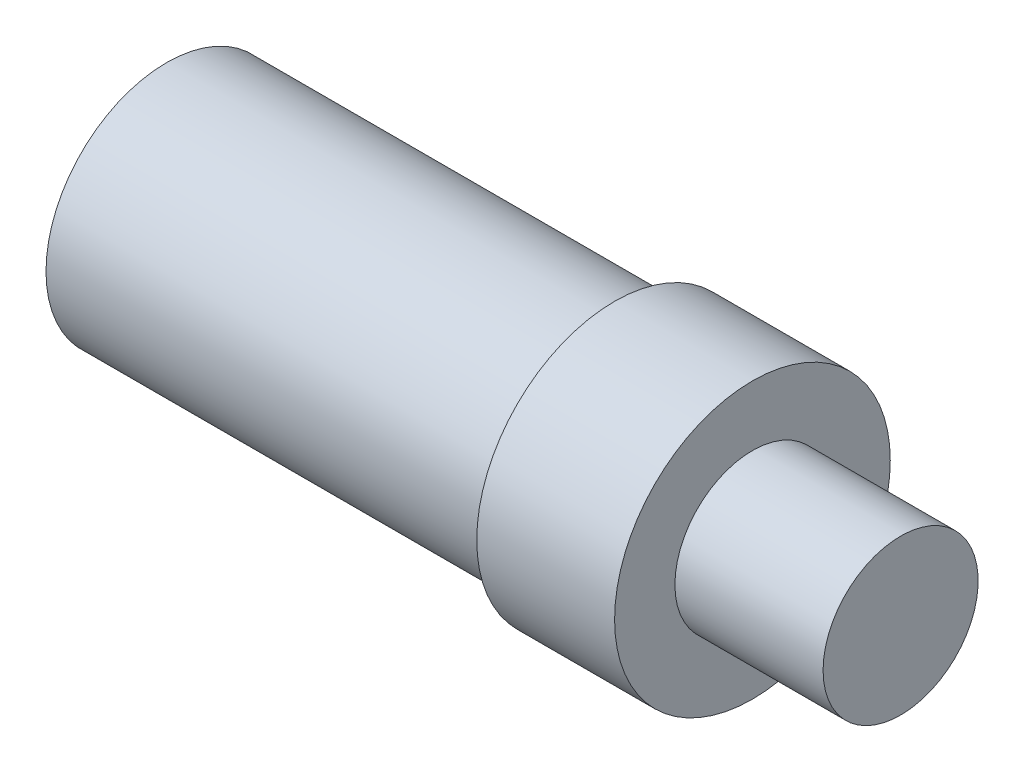
ISO-10303-21;
HEADER;
FILE_DESCRIPTION(('STEP AP214'),'2;1');
FILE_NAME('part.step','',(''),(''),'','','');
FILE_SCHEMA(('AUTOMOTIVE_DESIGN { 1 0 10303 214 1 1 1 1 }'));
ENDSEC;
DATA;
#1=APPLICATION_CONTEXT('core data for automotive mechanical design processes');
#2=APPLICATION_PROTOCOL_DEFINITION('international standard','automotive_design',2000,#1);
#3=PRODUCT_CONTEXT('',#1,'mechanical');
#4=PRODUCT('Part','Part','',(#3));
#5=PRODUCT_RELATED_PRODUCT_CATEGORY('part','',(#4));
#6=PRODUCT_DEFINITION_FORMATION('','',#4);
#7=PRODUCT_DEFINITION_CONTEXT('part definition',#1,'design');
#8=PRODUCT_DEFINITION('design','',#6,#7);
#9=PRODUCT_DEFINITION_SHAPE('','',#8);
#10=(LENGTH_UNIT() NAMED_UNIT(*) SI_UNIT(.MILLI.,.METRE.));
#11=(NAMED_UNIT(*) PLANE_ANGLE_UNIT() SI_UNIT($,.RADIAN.));
#12=(NAMED_UNIT(*) SI_UNIT($,.STERADIAN.) SOLID_ANGLE_UNIT());
#13=UNCERTAINTY_MEASURE_WITH_UNIT(LENGTH_MEASURE(1.E-05),#10,'distance_accuracy_value','');
#14=(GEOMETRIC_REPRESENTATION_CONTEXT(3) GLOBAL_UNCERTAINTY_ASSIGNED_CONTEXT((#13)) GLOBAL_UNIT_ASSIGNED_CONTEXT((#10,
#11,#12)) REPRESENTATION_CONTEXT('',''));
#15=CARTESIAN_POINT('',(0.,0.,0.));
#16=DIRECTION('',(0.,0.,1.));
#17=DIRECTION('',(1.,0.,0.));
#18=AXIS2_PLACEMENT_3D('',#15,#16,#17);
#19=CARTESIAN_POINT('',(-33.4,0.,0.));
#20=DIRECTION('',(-1.,0.,0.));
#21=DIRECTION('',(0.,0.,1.));
#22=AXIS2_PLACEMENT_3D('',#19,#20,#21);
#23=PLANE('',#22);
#24=CARTESIAN_POINT('',(-33.4,0.,0.));
#25=DIRECTION('',(-1.,0.,0.));
#26=DIRECTION('',(0.,0.,1.));
#27=AXIS2_PLACEMENT_3D('',#24,#25,#26);
#28=CIRCLE('',#27,4.5);
#29=CARTESIAN_POINT('',(-33.4,0.,4.5));
#30=VERTEX_POINT('',#29);
#31=EDGE_CURVE('E10',#30,#30,#28,.T.);
#32=ORIENTED_EDGE('',*,*,#31,.F.);
#33=EDGE_LOOP('',(#32));
#34=FACE_BOUND('',#33,.T.);
#35=ADVANCED_FACE('F39',(#34),#23,.F.);
#36=CARTESIAN_POINT('',(-300.,0.,0.));
#37=DIRECTION('',(-1.,0.,0.));
#38=DIRECTION('',(0.,0.,1.));
#39=AXIS2_PLACEMENT_3D('',#36,#37,#38);
#40=CYLINDRICAL_SURFACE('',#39,4.5);
#41=CARTESIAN_POINT('',(-42.,0.,0.));
#42=DIRECTION('',(-1.,0.,0.));
#43=DIRECTION('',(0.,0.,1.));
#44=AXIS2_PLACEMENT_3D('',#41,#42,#43);
#45=CIRCLE('',#44,4.5);
#46=CARTESIAN_POINT('',(-42.,0.,4.5));
#47=VERTEX_POINT('',#46);
#48=EDGE_CURVE('E44',#47,#47,#45,.T.);
#49=ORIENTED_EDGE('',*,*,#48,.F.);
#50=EDGE_LOOP('',(#49));
#51=FACE_BOUND('',#50,.T.);
#52=ORIENTED_EDGE('',*,*,#31,.T.);
#53=EDGE_LOOP('',(#52));
#54=FACE_BOUND('',#53,.T.);
#55=ADVANCED_FACE('F90',(#51,#54),#40,.T.);
#56=CARTESIAN_POINT('',(-42.,4.5,0.));
#57=DIRECTION('',(-1.,0.,0.));
#58=DIRECTION('',(0.,0.,1.));
#59=AXIS2_PLACEMENT_3D('',#56,#57,#58);
#60=PLANE('',#59);
#61=CARTESIAN_POINT('',(-42.,0.,0.));
#62=DIRECTION('',(-1.,0.,0.));
#63=DIRECTION('',(0.,0.,1.));
#64=AXIS2_PLACEMENT_3D('',#61,#62,#63);
#65=CIRCLE('',#64,8.);
#66=CARTESIAN_POINT('',(-42.,0.,8.));
#67=VERTEX_POINT('',#66);
#68=EDGE_CURVE('E47',#67,#67,#65,.T.);
#69=ORIENTED_EDGE('',*,*,#68,.F.);
#70=EDGE_LOOP('',(#69));
#71=FACE_BOUND('',#70,.T.);
#72=ORIENTED_EDGE('',*,*,#48,.T.);
#73=EDGE_LOOP('',(#72));
#74=FACE_BOUND('',#73,.T.);
#75=ADVANCED_FACE('F85',(#71,#74),#60,.F.);
#76=CARTESIAN_POINT('',(-300.,0.,0.));
#77=DIRECTION('',(-1.,0.,0.));
#78=DIRECTION('',(0.,0.,1.));
#79=AXIS2_PLACEMENT_3D('',#76,#77,#78);
#80=CYLINDRICAL_SURFACE('',#79,8.);
#81=CARTESIAN_POINT('',(-50.,0.,0.));
#82=DIRECTION('',(-1.,0.,0.));
#83=DIRECTION('',(0.,0.,1.));
#84=AXIS2_PLACEMENT_3D('',#81,#82,#83);
#85=CIRCLE('',#84,8.);
#86=CARTESIAN_POINT('',(-50.,0.,8.));
#87=VERTEX_POINT('',#86);
#88=EDGE_CURVE('E52',#87,#87,#85,.T.);
#89=ORIENTED_EDGE('',*,*,#88,.F.);
#90=EDGE_LOOP('',(#89));
#91=FACE_BOUND('',#90,.T.);
#92=ORIENTED_EDGE('',*,*,#68,.T.);
#93=EDGE_LOOP('',(#92));
#94=FACE_BOUND('',#93,.T.);
#95=ADVANCED_FACE('F78',(#91,#94),#80,.T.);
#96=CARTESIAN_POINT('',(-50.,8.,0.));
#97=DIRECTION('',(1.,0.,0.));
#98=DIRECTION('',(0.,0.,-1.));
#99=AXIS2_PLACEMENT_3D('',#96,#97,#98);
#100=PLANE('',#99);
#101=CARTESIAN_POINT('',(-50.,0.,0.));
#102=DIRECTION('',(-1.,0.,0.));
#103=DIRECTION('',(0.,0.,1.));
#104=AXIS2_PLACEMENT_3D('',#101,#102,#103);
#105=CIRCLE('',#104,7.);
#106=CARTESIAN_POINT('',(-50.,0.,7.));
#107=VERTEX_POINT('',#106);
#108=EDGE_CURVE('E59',#107,#107,#105,.T.);
#109=ORIENTED_EDGE('',*,*,#108,.F.);
#110=EDGE_LOOP('',(#109));
#111=FACE_BOUND('',#110,.T.);
#112=ORIENTED_EDGE('',*,*,#88,.T.);
#113=EDGE_LOOP('',(#112));
#114=FACE_BOUND('',#113,.T.);
#115=ADVANCED_FACE('F68',(#111,#114),#100,.F.);
#116=CARTESIAN_POINT('',(-300.,0.,0.));
#117=DIRECTION('',(-1.,0.,0.));
#118=DIRECTION('',(0.,0.,1.));
#119=AXIS2_PLACEMENT_3D('',#116,#117,#118);
#120=CYLINDRICAL_SURFACE('',#119,7.);
#121=CARTESIAN_POINT('',(-76.,0.,0.));
#122=DIRECTION('',(-1.,0.,0.));
#123=DIRECTION('',(0.,0.,1.));
#124=AXIS2_PLACEMENT_3D('',#121,#122,#123);
#125=CIRCLE('',#124,7.);
#126=CARTESIAN_POINT('',(-76.,0.,7.));
#127=VERTEX_POINT('',#126);
#128=EDGE_CURVE('E62',#127,#127,#125,.T.);
#129=ORIENTED_EDGE('',*,*,#128,.F.);
#130=EDGE_LOOP('',(#129));
#131=FACE_BOUND('',#130,.T.);
#132=ORIENTED_EDGE('',*,*,#108,.T.);
#133=EDGE_LOOP('',(#132));
#134=FACE_BOUND('',#133,.T.);
#135=ADVANCED_FACE('F70',(#131,#134),#120,.T.);
#136=CARTESIAN_POINT('',(-76.,7.,0.));
#137=DIRECTION('',(1.,0.,0.));
#138=DIRECTION('',(0.,0.,-1.));
#139=AXIS2_PLACEMENT_3D('',#136,#137,#138);
#140=PLANE('',#139);
#141=ORIENTED_EDGE('',*,*,#128,.T.);
#142=EDGE_LOOP('',(#141));
#143=FACE_BOUND('',#142,.T.);
#144=ADVANCED_FACE('F61',(#143),#140,.F.);
#145=CLOSED_SHELL('',(#35,#55,#75,#95,#115,#135,#144));
#146=MANIFOLD_SOLID_BREP('B2',#145);
#147=ADVANCED_BREP_SHAPE_REPRESENTATION('',(#18,#146),#14);
#148=SHAPE_DEFINITION_REPRESENTATION(#9,#147);
ENDSEC;
END-ISO-10303-21;
